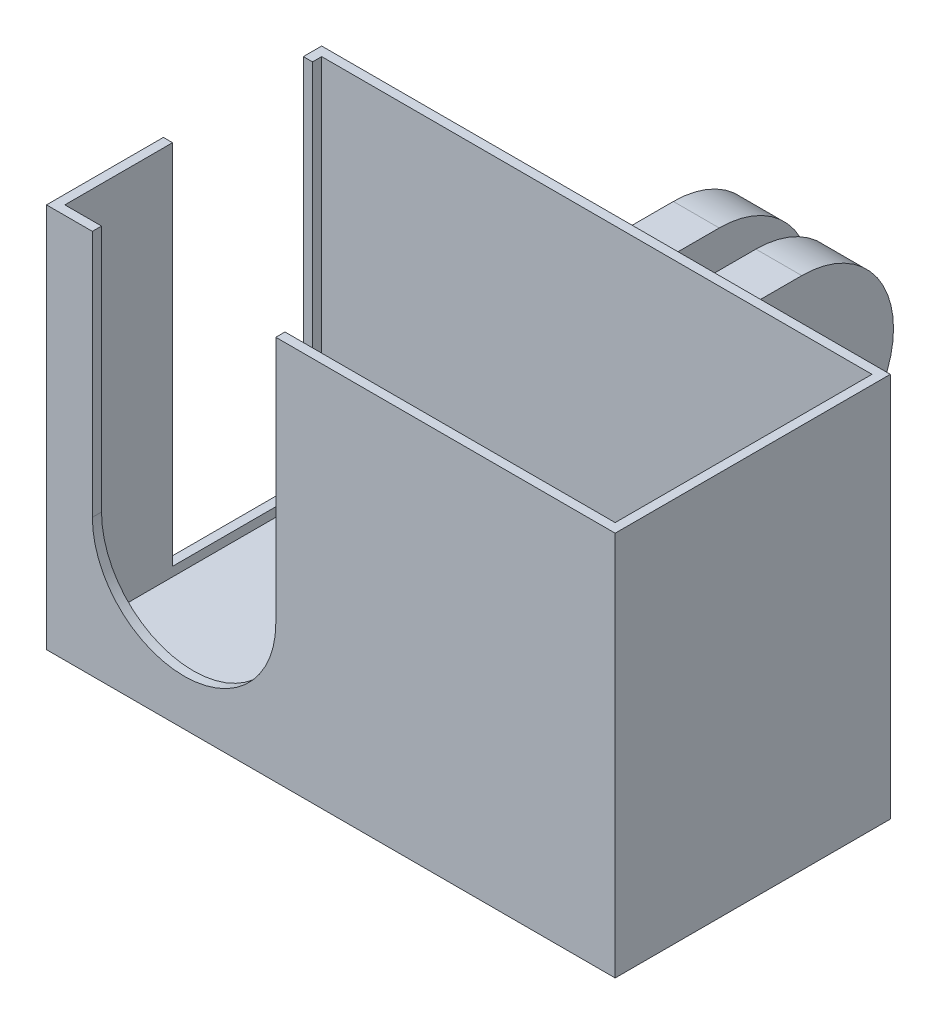
ISO-10303-21;
HEADER;
FILE_DESCRIPTION(('STEP AP214'),'2;1');
FILE_NAME('part.step','',(''),(''),'','','');
FILE_SCHEMA(('AUTOMOTIVE_DESIGN { 1 0 10303 214 1 1 1 1 }'));
ENDSEC;
DATA;
#1=APPLICATION_CONTEXT('core data for automotive mechanical design processes');
#2=APPLICATION_PROTOCOL_DEFINITION('international standard','automotive_design',2000,#1);
#3=PRODUCT_CONTEXT('',#1,'mechanical');
#4=PRODUCT('Part','Part','',(#3));
#5=PRODUCT_RELATED_PRODUCT_CATEGORY('part','',(#4));
#6=PRODUCT_DEFINITION_FORMATION('','',#4);
#7=PRODUCT_DEFINITION_CONTEXT('part definition',#1,'design');
#8=PRODUCT_DEFINITION('design','',#6,#7);
#9=PRODUCT_DEFINITION_SHAPE('','',#8);
#10=(LENGTH_UNIT() NAMED_UNIT(*) SI_UNIT(.MILLI.,.METRE.));
#11=(NAMED_UNIT(*) PLANE_ANGLE_UNIT() SI_UNIT($,.RADIAN.));
#12=(NAMED_UNIT(*) SI_UNIT($,.STERADIAN.) SOLID_ANGLE_UNIT());
#13=UNCERTAINTY_MEASURE_WITH_UNIT(LENGTH_MEASURE(1.E-05),#10,'distance_accuracy_value','');
#14=(GEOMETRIC_REPRESENTATION_CONTEXT(3) GLOBAL_UNCERTAINTY_ASSIGNED_CONTEXT((#13)) GLOBAL_UNIT_ASSIGNED_CONTEXT((#10,
#11,#12)) REPRESENTATION_CONTEXT('',''));
#15=CARTESIAN_POINT('',(0.,0.,0.));
#16=DIRECTION('',(0.,0.,1.));
#17=DIRECTION('',(1.,0.,0.));
#18=AXIS2_PLACEMENT_3D('',#15,#16,#17);
#19=CARTESIAN_POINT('',(-30.346218487395,18.5050420168067,30.));
#20=DIRECTION('',(0.,-1.,0.));
#21=DIRECTION('',(0.,0.,-1.));
#22=AXIS2_PLACEMENT_3D('',#19,#20,#21);
#23=PLANE('',#22);
#24=DIRECTION('',(0.,0.,-1.));
#25=VECTOR('',#24,1.);
#26=CARTESIAN_POINT('',(-30.346218487395,18.5050420168067,30.));
#27=LINE('',#26,#25);
#28=CARTESIAN_POINT('',(-30.346218487395,18.5050420168067,2.));
#29=VERTEX_POINT('',#28);
#30=CARTESIAN_POINT('',(-30.346218487395,18.5050420168067,0.));
#31=VERTEX_POINT('',#30);
#32=EDGE_CURVE('E363',#29,#31,#27,.T.);
#33=ORIENTED_EDGE('',*,*,#32,.F.);
#34=DIRECTION('',(-1.,0.,0.));
#35=VECTOR('',#34,1.);
#36=CARTESIAN_POINT('',(13.4641809395834,18.5050420168067,2.));
#37=LINE('',#36,#35);
#38=CARTESIAN_POINT('',(-29.346218487395,18.5050420168067,2.));
#39=VERTEX_POINT('',#38);
#40=EDGE_CURVE('E228',#39,#29,#37,.T.);
#41=ORIENTED_EDGE('',*,*,#40,.F.);
#42=DIRECTION('',(0.,0.,1.));
#43=VECTOR('',#42,1.);
#44=CARTESIAN_POINT('',(-29.346218487395,18.5050420168067,1.));
#45=LINE('',#44,#43);
#46=CARTESIAN_POINT('',(-29.346218487395,18.5050420168067,1.));
#47=VERTEX_POINT('',#46);
#48=EDGE_CURVE('E324',#47,#39,#45,.T.);
#49=ORIENTED_EDGE('',*,*,#48,.F.);
#50=DIRECTION('',(-1.,0.,0.));
#51=VECTOR('',#50,1.);
#52=CARTESIAN_POINT('',(-29.346218487395,18.5050420168067,1.));
#53=LINE('',#52,#51);
#54=CARTESIAN_POINT('',(30.653781512605,18.5050420168067,1.));
#55=VERTEX_POINT('',#54);
#56=EDGE_CURVE('E313',#55,#47,#53,.T.);
#57=ORIENTED_EDGE('',*,*,#56,.F.);
#58=DIRECTION('',(0.,0.,-1.));
#59=VECTOR('',#58,1.);
#60=CARTESIAN_POINT('',(30.653781512605,18.5050420168067,1.));
#61=LINE('',#60,#59);
#62=CARTESIAN_POINT('',(30.653781512605,18.5050420168067,29.));
#63=VERTEX_POINT('',#62);
#64=EDGE_CURVE('E317',#63,#55,#61,.T.);
#65=ORIENTED_EDGE('',*,*,#64,.F.);
#66=DIRECTION('',(1.,0.,0.));
#67=VECTOR('',#66,1.);
#68=CARTESIAN_POINT('',(-29.346218487395,18.5050420168067,29.));
#69=LINE('',#68,#67);
#70=CARTESIAN_POINT('',(-5.34621848739497,18.5050420168067,29.));
#71=VERTEX_POINT('',#70);
#72=EDGE_CURVE('E323',#71,#63,#69,.T.);
#73=ORIENTED_EDGE('',*,*,#72,.F.);
#74=DIRECTION('',(0.,0.,-1.));
#75=VECTOR('',#74,1.);
#76=CARTESIAN_POINT('',(-5.34621848739496,18.5050420168067,29.));
#77=LINE('',#76,#75);
#78=CARTESIAN_POINT('',(-5.34621848739496,18.5050420168067,30.));
#79=VERTEX_POINT('',#78);
#80=EDGE_CURVE('E297',#79,#71,#77,.T.);
#81=ORIENTED_EDGE('',*,*,#80,.F.);
#82=DIRECTION('',(-1.,0.,0.));
#83=VECTOR('',#82,1.);
#84=CARTESIAN_POINT('',(-30.346218487395,18.5050420168067,30.));
#85=LINE('',#84,#83);
#86=CARTESIAN_POINT('',(31.653781512605,18.5050420168067,30.));
#87=VERTEX_POINT('',#86);
#88=EDGE_CURVE('E360',#87,#79,#85,.T.);
#89=ORIENTED_EDGE('',*,*,#88,.F.);
#90=DIRECTION('',(0.,0.,-1.));
#91=VECTOR('',#90,1.);
#92=CARTESIAN_POINT('',(31.653781512605,18.5050420168067,30.));
#93=LINE('',#92,#91);
#94=CARTESIAN_POINT('',(31.653781512605,18.5050420168067,0.));
#95=VERTEX_POINT('',#94);
#96=EDGE_CURVE('E373',#87,#95,#93,.T.);
#97=ORIENTED_EDGE('',*,*,#96,.T.);
#98=DIRECTION('',(-1.,0.,0.));
#99=VECTOR('',#98,1.);
#100=CARTESIAN_POINT('',(-30.346218487395,18.5050420168067,0.));
#101=LINE('',#100,#99);
#102=EDGE_CURVE('E355',#95,#31,#101,.T.);
#103=ORIENTED_EDGE('',*,*,#102,.T.);
#104=EDGE_LOOP('',(#33,#41,#49,#57,#65,#73,#81,#89,#97,#103));
#105=FACE_BOUND('',#104,.T.);
#106=ADVANCED_FACE('F37',(#105),#23,.F.);
#107=CARTESIAN_POINT('',(0.,0.,0.));
#108=DIRECTION('',(0.,0.,1.));
#109=DIRECTION('',(1.,0.,0.));
#110=AXIS2_PLACEMENT_3D('',#107,#108,#109);
#111=PLANE('',#110);
#112=DIRECTION('',(0.,-1.,0.));
#113=VECTOR('',#112,1.);
#114=CARTESIAN_POINT('',(-30.346218487395,18.5050420168067,0.));
#115=LINE('',#114,#113);
#116=CARTESIAN_POINT('',(-30.346218487395,-23.4949579831933,0.));
#117=VERTEX_POINT('',#116);
#118=EDGE_CURVE('E350',#31,#117,#115,.T.);
#119=ORIENTED_EDGE('',*,*,#118,.F.);
#120=ORIENTED_EDGE('',*,*,#102,.F.);
#121=DIRECTION('',(0.,1.,0.));
#122=VECTOR('',#121,1.);
#123=CARTESIAN_POINT('',(31.653781512605,18.5050420168067,0.));
#124=LINE('',#123,#122);
#125=CARTESIAN_POINT('',(31.653781512605,-23.4949579831933,0.));
#126=VERTEX_POINT('',#125);
#127=EDGE_CURVE('E368',#126,#95,#124,.T.);
#128=ORIENTED_EDGE('',*,*,#127,.F.);
#129=DIRECTION('',(1.,0.,0.));
#130=VECTOR('',#129,1.);
#131=CARTESIAN_POINT('',(-30.346218487395,-23.4949579831933,0.));
#132=LINE('',#131,#130);
#133=EDGE_CURVE('E366',#117,#126,#132,.T.);
#134=ORIENTED_EDGE('',*,*,#133,.F.);
#135=EDGE_LOOP('',(#119,#120,#128,#134));
#136=FACE_BOUND('',#135,.T.);
#137=DIRECTION('',(-1.,0.,0.));
#138=VECTOR('',#137,1.);
#139=CARTESIAN_POINT('',(7.,7.99964293282017,0.));
#140=LINE('',#139,#138);
#141=CARTESIAN_POINT('',(7.,7.99964293282017,0.));
#142=VERTEX_POINT('',#141);
#143=CARTESIAN_POINT('',(2.,7.99964293282017,0.));
#144=VERTEX_POINT('',#143);
#145=EDGE_CURVE('E272',#142,#144,#140,.T.);
#146=ORIENTED_EDGE('',*,*,#145,.T.);
#147=DIRECTION('',(0.,-1.,0.));
#148=VECTOR('',#147,1.);
#149=CARTESIAN_POINT('',(2.,7.99964293282017,0.));
#150=LINE('',#149,#148);
#151=CARTESIAN_POINT('',(2.,-12.0003570671798,0.));
#152=VERTEX_POINT('',#151);
#153=EDGE_CURVE('E256',#144,#152,#150,.T.);
#154=ORIENTED_EDGE('',*,*,#153,.T.);
#155=DIRECTION('',(-1.,0.,0.));
#156=VECTOR('',#155,1.);
#157=CARTESIAN_POINT('',(7.,-12.0003570671798,0.));
#158=LINE('',#157,#156);
#159=CARTESIAN_POINT('',(7.,-12.0003570671798,0.));
#160=VERTEX_POINT('',#159);
#161=EDGE_CURVE('E289',#160,#152,#158,.T.);
#162=ORIENTED_EDGE('',*,*,#161,.F.);
#163=DIRECTION('',(0.,-1.,0.));
#164=VECTOR('',#163,1.);
#165=CARTESIAN_POINT('',(7.,7.99964293282017,0.));
#166=LINE('',#165,#164);
#167=EDGE_CURVE('E262',#142,#160,#166,.T.);
#168=ORIENTED_EDGE('',*,*,#167,.F.);
#169=EDGE_LOOP('',(#146,#154,#162,#168));
#170=FACE_BOUND('',#169,.T.);
#171=DIRECTION('',(0.,-1.,0.));
#172=VECTOR('',#171,1.);
#173=CARTESIAN_POINT('',(-7.,-12.0003570671798,0.));
#174=LINE('',#173,#172);
#175=CARTESIAN_POINT('',(-7.,7.99964293282017,0.));
#176=VERTEX_POINT('',#175);
#177=CARTESIAN_POINT('',(-7.,-12.0003570671798,0.));
#178=VERTEX_POINT('',#177);
#179=EDGE_CURVE('E243',#176,#178,#174,.T.);
#180=ORIENTED_EDGE('',*,*,#179,.T.);
#181=DIRECTION('',(1.,0.,0.));
#182=VECTOR('',#181,1.);
#183=CARTESIAN_POINT('',(-7.,-12.0003570671798,0.));
#184=LINE('',#183,#182);
#185=CARTESIAN_POINT('',(-2.,-12.0003570671798,0.));
#186=VERTEX_POINT('',#185);
#187=EDGE_CURVE('E253',#178,#186,#184,.T.);
#188=ORIENTED_EDGE('',*,*,#187,.T.);
#189=DIRECTION('',(0.,-1.,0.));
#190=VECTOR('',#189,1.);
#191=CARTESIAN_POINT('',(-2.,-12.0003570671798,0.));
#192=LINE('',#191,#190);
#193=CARTESIAN_POINT('',(-2.,7.99964293282017,0.));
#194=VERTEX_POINT('',#193);
#195=EDGE_CURVE('E238',#194,#186,#192,.T.);
#196=ORIENTED_EDGE('',*,*,#195,.F.);
#197=DIRECTION('',(1.,0.,0.));
#198=VECTOR('',#197,1.);
#199=CARTESIAN_POINT('',(-7.,7.99964293282017,0.));
#200=LINE('',#199,#198);
#201=EDGE_CURVE('E257',#176,#194,#200,.T.);
#202=ORIENTED_EDGE('',*,*,#201,.F.);
#203=EDGE_LOOP('',(#180,#188,#196,#202));
#204=FACE_BOUND('',#203,.T.);
#205=ADVANCED_FACE('F387',(#136,#170,#204),#111,.F.);
#206=CARTESIAN_POINT('',(-15.346218487395,-8.49495798319328,24.));
#207=DIRECTION('',(0.,0.,1.));
#208=DIRECTION('',(1.,0.,0.));
#209=AXIS2_PLACEMENT_3D('',#206,#207,#208);
#210=CYLINDRICAL_SURFACE('',#209,10.);
#211=DIRECTION('',(0.,0.,1.));
#212=VECTOR('',#211,1.);
#213=CARTESIAN_POINT('',(-25.346218487395,-8.49495798319327,29.));
#214=LINE('',#213,#212);
#215=CARTESIAN_POINT('',(-25.346218487395,-8.49495798319327,29.));
#216=VERTEX_POINT('',#215);
#217=CARTESIAN_POINT('',(-25.346218487395,-8.49495798319327,30.));
#218=VERTEX_POINT('',#217);
#219=EDGE_CURVE('E293',#216,#218,#214,.T.);
#220=ORIENTED_EDGE('',*,*,#219,.T.);
#221=CARTESIAN_POINT('',(-15.346218487395,-8.49495798319328,30.));
#222=DIRECTION('',(0.,0.,1.));
#223=DIRECTION('',(1.,0.,0.));
#224=AXIS2_PLACEMENT_3D('',#221,#222,#223);
#225=CIRCLE('',#224,10.);
#226=CARTESIAN_POINT('',(-5.34621848739496,-8.49495798319327,30.));
#227=VERTEX_POINT('',#226);
#228=EDGE_CURVE('E346',#218,#227,#225,.T.);
#229=ORIENTED_EDGE('',*,*,#228,.T.);
#230=DIRECTION('',(0.,0.,-1.));
#231=VECTOR('',#230,1.);
#232=CARTESIAN_POINT('',(-5.34621848739496,-8.49495798319327,29.));
#233=LINE('',#232,#231);
#234=CARTESIAN_POINT('',(-5.34621848739496,-8.49495798319327,29.));
#235=VERTEX_POINT('',#234);
#236=EDGE_CURVE('E296',#227,#235,#233,.T.);
#237=ORIENTED_EDGE('',*,*,#236,.T.);
#238=CARTESIAN_POINT('',(-15.346218487395,-8.49495798319328,29.));
#239=DIRECTION('',(0.,0.,1.));
#240=DIRECTION('',(1.,0.,0.));
#241=AXIS2_PLACEMENT_3D('',#238,#239,#240);
#242=CIRCLE('',#241,10.);
#243=EDGE_CURVE('E41',#235,#216,#242,.F.);
#244=ORIENTED_EDGE('',*,*,#243,.T.);
#245=EDGE_LOOP('',(#220,#229,#237,#244));
#246=FACE_BOUND('',#245,.T.);
#247=ADVANCED_FACE('F440',(#246),#210,.F.);
#248=CARTESIAN_POINT('',(-30.346218487395,18.5050420168067,30.));
#249=DIRECTION('',(1.,0.,0.));
#250=DIRECTION('',(0.,0.,-1.));
#251=AXIS2_PLACEMENT_3D('',#248,#249,#250);
#252=PLANE('',#251);
#253=DIRECTION('',(0.,0.,1.));
#254=VECTOR('',#253,1.);
#255=CARTESIAN_POINT('',(-30.346218487395,-21.4949579831933,2.));
#256=LINE('',#255,#254);
#257=CARTESIAN_POINT('',(-30.346218487395,-21.4949579831933,2.));
#258=VERTEX_POINT('',#257);
#259=CARTESIAN_POINT('',(-30.346218487395,-21.4949579831933,17.2555006177255));
#260=VERTEX_POINT('',#259);
#261=EDGE_CURVE('E210',#258,#260,#256,.T.);
#262=ORIENTED_EDGE('',*,*,#261,.F.);
#263=DIRECTION('',(0.,-1.,0.));
#264=VECTOR('',#263,1.);
#265=CARTESIAN_POINT('',(-30.346218487395,-21.4949579831933,2.));
#266=LINE('',#265,#264);
#267=EDGE_CURVE('E207',#29,#258,#266,.T.);
#268=ORIENTED_EDGE('',*,*,#267,.F.);
#269=ORIENTED_EDGE('',*,*,#32,.T.);
#270=ORIENTED_EDGE('',*,*,#118,.T.);
#271=DIRECTION('',(0.,0.,-1.));
#272=VECTOR('',#271,1.);
#273=CARTESIAN_POINT('',(-30.346218487395,-23.4949579831933,30.));
#274=LINE('',#273,#272);
#275=CARTESIAN_POINT('',(-30.346218487395,-23.4949579831933,30.));
#276=VERTEX_POINT('',#275);
#277=EDGE_CURVE('E11',#276,#117,#274,.T.);
#278=ORIENTED_EDGE('',*,*,#277,.F.);
#279=DIRECTION('',(0.,-1.,0.));
#280=VECTOR('',#279,1.);
#281=CARTESIAN_POINT('',(-30.346218487395,18.5050420168067,30.));
#282=LINE('',#281,#280);
#283=CARTESIAN_POINT('',(-30.346218487395,18.5050420168067,30.));
#284=VERTEX_POINT('',#283);
#285=EDGE_CURVE('E351',#284,#276,#282,.T.);
#286=ORIENTED_EDGE('',*,*,#285,.F.);
#287=CARTESIAN_POINT('',(-30.346218487395,18.5050420168067,17.2555006177255));
#288=VERTEX_POINT('',#287);
#289=EDGE_CURVE('E221',#284,#288,#27,.T.);
#290=ORIENTED_EDGE('',*,*,#289,.T.);
#291=DIRECTION('',(0.,1.,0.));
#292=VECTOR('',#291,1.);
#293=CARTESIAN_POINT('',(-30.346218487395,-21.4949579831933,17.2555006177255));
#294=LINE('',#293,#292);
#295=EDGE_CURVE('E203',#260,#288,#294,.T.);
#296=ORIENTED_EDGE('',*,*,#295,.F.);
#297=EDGE_LOOP('',(#262,#268,#269,#270,#278,#286,#290,#296));
#298=FACE_BOUND('',#297,.T.);
#299=ADVANCED_FACE('F39',(#298),#252,.F.);
#300=CARTESIAN_POINT('',(-30.346218487395,-23.4949579831933,30.));
#301=DIRECTION('',(0.,1.,0.));
#302=DIRECTION('',(0.,0.,1.));
#303=AXIS2_PLACEMENT_3D('',#300,#301,#302);
#304=PLANE('',#303);
#305=ORIENTED_EDGE('',*,*,#133,.T.);
#306=DIRECTION('',(0.,0.,-1.));
#307=VECTOR('',#306,1.);
#308=CARTESIAN_POINT('',(31.653781512605,-23.4949579831933,30.));
#309=LINE('',#308,#307);
#310=CARTESIAN_POINT('',(31.653781512605,-23.4949579831933,30.));
#311=VERTEX_POINT('',#310);
#312=EDGE_CURVE('E46',#311,#126,#309,.T.);
#313=ORIENTED_EDGE('',*,*,#312,.F.);
#314=DIRECTION('',(1.,0.,0.));
#315=VECTOR('',#314,1.);
#316=CARTESIAN_POINT('',(-30.346218487395,-23.4949579831933,30.));
#317=LINE('',#316,#315);
#318=EDGE_CURVE('E354',#276,#311,#317,.T.);
#319=ORIENTED_EDGE('',*,*,#318,.F.);
#320=ORIENTED_EDGE('',*,*,#277,.T.);
#321=EDGE_LOOP('',(#305,#313,#319,#320));
#322=FACE_BOUND('',#321,.T.);
#323=ADVANCED_FACE('F400',(#322),#304,.F.);
#324=CARTESIAN_POINT('',(31.653781512605,18.5050420168067,30.));
#325=DIRECTION('',(-1.,0.,0.));
#326=DIRECTION('',(0.,-1.,0.));
#327=AXIS2_PLACEMENT_3D('',#324,#325,#326);
#328=PLANE('',#327);
#329=ORIENTED_EDGE('',*,*,#127,.T.);
#330=ORIENTED_EDGE('',*,*,#96,.F.);
#331=DIRECTION('',(0.,1.,0.));
#332=VECTOR('',#331,1.);
#333=CARTESIAN_POINT('',(31.653781512605,18.5050420168067,30.));
#334=LINE('',#333,#332);
#335=EDGE_CURVE('E357',#311,#87,#334,.T.);
#336=ORIENTED_EDGE('',*,*,#335,.F.);
#337=ORIENTED_EDGE('',*,*,#312,.T.);
#338=EDGE_LOOP('',(#329,#330,#336,#337));
#339=FACE_BOUND('',#338,.T.);
#340=ADVANCED_FACE('F381',(#339),#328,.F.);
#341=CARTESIAN_POINT('',(-29.346218487395,18.5050420168067,17.2555006177255));
#342=VERTEX_POINT('',#341);
#343=CARTESIAN_POINT('',(-29.346218487395,18.5050420168067,29.));
#344=VERTEX_POINT('',#343);
#345=EDGE_CURVE('E305',#342,#344,#45,.T.);
#346=ORIENTED_EDGE('',*,*,#345,.F.);
#347=DIRECTION('',(-1.,0.,0.));
#348=VECTOR('',#347,1.);
#349=CARTESIAN_POINT('',(13.4641809395834,18.5050420168067,17.2555006177255));
#350=LINE('',#349,#348);
#351=EDGE_CURVE('E53',#342,#288,#350,.T.);
#352=ORIENTED_EDGE('',*,*,#351,.T.);
#353=ORIENTED_EDGE('',*,*,#289,.F.);
#354=CARTESIAN_POINT('',(-25.346218487395,18.5050420168067,30.));
#355=VERTEX_POINT('',#354);
#356=EDGE_CURVE('E359',#355,#284,#85,.T.);
#357=ORIENTED_EDGE('',*,*,#356,.F.);
#358=DIRECTION('',(0.,0.,1.));
#359=VECTOR('',#358,1.);
#360=CARTESIAN_POINT('',(-25.346218487395,18.5050420168067,29.));
#361=LINE('',#360,#359);
#362=CARTESIAN_POINT('',(-25.346218487395,18.5050420168067,29.));
#363=VERTEX_POINT('',#362);
#364=EDGE_CURVE('E292',#363,#355,#361,.T.);
#365=ORIENTED_EDGE('',*,*,#364,.F.);
#366=EDGE_CURVE('E320',#344,#363,#69,.T.);
#367=ORIENTED_EDGE('',*,*,#366,.F.);
#368=EDGE_LOOP('',(#346,#352,#353,#357,#365,#367));
#369=FACE_BOUND('',#368,.T.);
#370=ADVANCED_FACE('F436',(#369),#23,.F.);
#371=CARTESIAN_POINT('',(0.,0.,30.));
#372=DIRECTION('',(0.,0.,1.));
#373=DIRECTION('',(1.,0.,0.));
#374=AXIS2_PLACEMENT_3D('',#371,#372,#373);
#375=PLANE('',#374);
#376=DIRECTION('',(0.,1.,0.));
#377=VECTOR('',#376,1.);
#378=CARTESIAN_POINT('',(-25.346218487395,-8.49495798319327,30.));
#379=LINE('',#378,#377);
#380=EDGE_CURVE('E300',#218,#355,#379,.T.);
#381=ORIENTED_EDGE('',*,*,#380,.T.);
#382=ORIENTED_EDGE('',*,*,#356,.T.);
#383=ORIENTED_EDGE('',*,*,#285,.T.);
#384=ORIENTED_EDGE('',*,*,#318,.T.);
#385=ORIENTED_EDGE('',*,*,#335,.T.);
#386=ORIENTED_EDGE('',*,*,#88,.T.);
#387=DIRECTION('',(0.,1.,0.));
#388=VECTOR('',#387,1.);
#389=CARTESIAN_POINT('',(-5.34621848739496,-8.49495798319327,30.));
#390=LINE('',#389,#388);
#391=EDGE_CURVE('E309',#227,#79,#390,.T.);
#392=ORIENTED_EDGE('',*,*,#391,.F.);
#393=ORIENTED_EDGE('',*,*,#228,.F.);
#394=EDGE_LOOP('',(#381,#382,#383,#384,#385,#386,#392,#393));
#395=FACE_BOUND('',#394,.T.);
#396=ADVANCED_FACE('F397',(#395),#375,.T.);
#397=CARTESIAN_POINT('',(-29.346218487395,-88.7067394121807,29.));
#398=DIRECTION('',(0.,0.,1.));
#399=DIRECTION('',(1.,0.,0.));
#400=AXIS2_PLACEMENT_3D('',#397,#398,#399);
#401=PLANE('',#400);
#402=ORIENTED_EDGE('',*,*,#366,.T.);
#403=DIRECTION('',(0.,1.,0.));
#404=VECTOR('',#403,1.);
#405=CARTESIAN_POINT('',(-25.346218487395,-8.49495798319327,29.));
#406=LINE('',#405,#404);
#407=EDGE_CURVE('E303',#216,#363,#406,.T.);
#408=ORIENTED_EDGE('',*,*,#407,.F.);
#409=ORIENTED_EDGE('',*,*,#243,.F.);
#410=DIRECTION('',(0.,1.,0.));
#411=VECTOR('',#410,1.);
#412=CARTESIAN_POINT('',(-5.34621848739496,-8.49495798319327,29.));
#413=LINE('',#412,#411);
#414=EDGE_CURVE('E306',#235,#71,#413,.T.);
#415=ORIENTED_EDGE('',*,*,#414,.T.);
#416=ORIENTED_EDGE('',*,*,#72,.T.);
#417=DIRECTION('',(0.,1.,0.));
#418=VECTOR('',#417,1.);
#419=CARTESIAN_POINT('',(30.653781512605,-88.7067394121807,29.));
#420=LINE('',#419,#418);
#421=CARTESIAN_POINT('',(30.653781512605,-22.4949579831933,29.));
#422=VERTEX_POINT('',#421);
#423=EDGE_CURVE('E329',#422,#63,#420,.T.);
#424=ORIENTED_EDGE('',*,*,#423,.F.);
#425=DIRECTION('',(1.,0.,0.));
#426=VECTOR('',#425,1.);
#427=CARTESIAN_POINT('',(-29.346218487395,-22.4949579831933,29.));
#428=LINE('',#427,#426);
#429=CARTESIAN_POINT('',(-29.346218487395,-22.4949579831933,29.));
#430=VERTEX_POINT('',#429);
#431=EDGE_CURVE('E316',#430,#422,#428,.T.);
#432=ORIENTED_EDGE('',*,*,#431,.F.);
#433=DIRECTION('',(0.,1.,0.));
#434=VECTOR('',#433,1.);
#435=CARTESIAN_POINT('',(-29.346218487395,-88.7067394121807,29.));
#436=LINE('',#435,#434);
#437=EDGE_CURVE('E332',#430,#344,#436,.T.);
#438=ORIENTED_EDGE('',*,*,#437,.T.);
#439=EDGE_LOOP('',(#402,#408,#409,#415,#416,#424,#432,#438));
#440=FACE_BOUND('',#439,.T.);
#441=ADVANCED_FACE('F419',(#440),#401,.F.);
#442=CARTESIAN_POINT('',(-29.346218487395,17.5050420168067,0.999999999999997));
#443=DIRECTION('',(-1.,0.,0.));
#444=DIRECTION('',(0.,-1.,0.));
#445=AXIS2_PLACEMENT_3D('',#442,#443,#444);
#446=PLANE('',#445);
#447=ORIENTED_EDGE('',*,*,#48,.T.);
#448=DIRECTION('',(0.,1.,0.));
#449=VECTOR('',#448,1.);
#450=CARTESIAN_POINT('',(-29.346218487395,-21.4949579831933,2.));
#451=LINE('',#450,#449);
#452=CARTESIAN_POINT('',(-29.346218487395,-21.4949579831933,2.));
#453=VERTEX_POINT('',#452);
#454=EDGE_CURVE('E227',#453,#39,#451,.T.);
#455=ORIENTED_EDGE('',*,*,#454,.F.);
#456=DIRECTION('',(0.,0.,-1.));
#457=VECTOR('',#456,1.);
#458=CARTESIAN_POINT('',(-29.346218487395,-21.4949579831933,2.));
#459=LINE('',#458,#457);
#460=CARTESIAN_POINT('',(-29.346218487395,-21.4949579831933,17.2555006177255));
#461=VERTEX_POINT('',#460);
#462=EDGE_CURVE('E233',#461,#453,#459,.T.);
#463=ORIENTED_EDGE('',*,*,#462,.F.);
#464=DIRECTION('',(0.,-1.,0.));
#465=VECTOR('',#464,1.);
#466=CARTESIAN_POINT('',(-29.346218487395,-21.4949579831933,17.2555006177255));
#467=LINE('',#466,#465);
#468=EDGE_CURVE('E204',#342,#461,#467,.T.);
#469=ORIENTED_EDGE('',*,*,#468,.F.);
#470=ORIENTED_EDGE('',*,*,#345,.T.);
#471=ORIENTED_EDGE('',*,*,#437,.F.);
#472=DIRECTION('',(0.,0.,1.));
#473=VECTOR('',#472,1.);
#474=CARTESIAN_POINT('',(-29.346218487395,-22.4949579831933,0.999999999999997));
#475=LINE('',#474,#473);
#476=CARTESIAN_POINT('',(-29.346218487395,-22.4949579831933,0.999999999999997));
#477=VERTEX_POINT('',#476);
#478=EDGE_CURVE('E343',#477,#430,#475,.T.);
#479=ORIENTED_EDGE('',*,*,#478,.F.);
#480=DIRECTION('',(0.,-1.,0.));
#481=VECTOR('',#480,1.);
#482=CARTESIAN_POINT('',(-29.346218487395,17.5050420168067,0.999999999999997));
#483=LINE('',#482,#481);
#484=EDGE_CURVE('E335',#47,#477,#483,.T.);
#485=ORIENTED_EDGE('',*,*,#484,.F.);
#486=EDGE_LOOP('',(#447,#455,#463,#469,#470,#471,#479,#485));
#487=FACE_BOUND('',#486,.T.);
#488=ADVANCED_FACE('F407',(#487),#446,.F.);
#489=CARTESIAN_POINT('',(0.,0.,0.999999999999997));
#490=DIRECTION('',(0.,0.,1.));
#491=DIRECTION('',(1.,0.,0.));
#492=AXIS2_PLACEMENT_3D('',#489,#490,#491);
#493=PLANE('',#492);
#494=ORIENTED_EDGE('',*,*,#484,.T.);
#495=DIRECTION('',(1.,0.,0.));
#496=VECTOR('',#495,1.);
#497=CARTESIAN_POINT('',(-29.346218487395,-22.4949579831933,0.999999999999997));
#498=LINE('',#497,#496);
#499=CARTESIAN_POINT('',(30.6537815126051,-22.4949579831933,0.999999999999997));
#500=VERTEX_POINT('',#499);
#501=EDGE_CURVE('E338',#477,#500,#498,.T.);
#502=ORIENTED_EDGE('',*,*,#501,.T.);
#503=DIRECTION('',(0.,1.,0.));
#504=VECTOR('',#503,1.);
#505=CARTESIAN_POINT('',(30.653781512605,17.5050420168067,0.999999999999997));
#506=LINE('',#505,#504);
#507=EDGE_CURVE('E341',#500,#55,#506,.T.);
#508=ORIENTED_EDGE('',*,*,#507,.T.);
#509=ORIENTED_EDGE('',*,*,#56,.T.);
#510=EDGE_LOOP('',(#494,#502,#508,#509));
#511=FACE_BOUND('',#510,.T.);
#512=ADVANCED_FACE('F411',(#511),#493,.T.);
#513=CARTESIAN_POINT('',(30.653781512605,17.5050420168067,0.999999999999997));
#514=DIRECTION('',(1.,0.,0.));
#515=DIRECTION('',(0.,1.,0.));
#516=AXIS2_PLACEMENT_3D('',#513,#514,#515);
#517=PLANE('',#516);
#518=DIRECTION('',(0.,0.,1.));
#519=VECTOR('',#518,1.);
#520=CARTESIAN_POINT('',(30.6537815126051,-22.4949579831933,0.999999999999997));
#521=LINE('',#520,#519);
#522=EDGE_CURVE('E344',#500,#422,#521,.T.);
#523=ORIENTED_EDGE('',*,*,#522,.T.);
#524=ORIENTED_EDGE('',*,*,#423,.T.);
#525=ORIENTED_EDGE('',*,*,#64,.T.);
#526=ORIENTED_EDGE('',*,*,#507,.F.);
#527=EDGE_LOOP('',(#523,#524,#525,#526));
#528=FACE_BOUND('',#527,.T.);
#529=ADVANCED_FACE('F415',(#528),#517,.F.);
#530=CARTESIAN_POINT('',(-29.346218487395,-22.4949579831933,0.999999999999997));
#531=DIRECTION('',(0.,-1.,0.));
#532=DIRECTION('',(0.,0.,-1.));
#533=AXIS2_PLACEMENT_3D('',#530,#531,#532);
#534=PLANE('',#533);
#535=ORIENTED_EDGE('',*,*,#478,.T.);
#536=ORIENTED_EDGE('',*,*,#431,.T.);
#537=ORIENTED_EDGE('',*,*,#522,.F.);
#538=ORIENTED_EDGE('',*,*,#501,.F.);
#539=EDGE_LOOP('',(#535,#536,#537,#538));
#540=FACE_BOUND('',#539,.T.);
#541=ADVANCED_FACE('F421',(#540),#534,.F.);
#542=CARTESIAN_POINT('',(-5.34621848739496,-8.49495798319327,29.));
#543=DIRECTION('',(1.,0.,0.));
#544=DIRECTION('',(0.,0.,-1.));
#545=AXIS2_PLACEMENT_3D('',#542,#543,#544);
#546=PLANE('',#545);
#547=ORIENTED_EDGE('',*,*,#80,.T.);
#548=ORIENTED_EDGE('',*,*,#414,.F.);
#549=ORIENTED_EDGE('',*,*,#236,.F.);
#550=ORIENTED_EDGE('',*,*,#391,.T.);
#551=EDGE_LOOP('',(#547,#548,#549,#550));
#552=FACE_BOUND('',#551,.T.);
#553=ADVANCED_FACE('F423',(#552),#546,.F.);
#554=CARTESIAN_POINT('',(-25.346218487395,-8.49495798319327,29.));
#555=DIRECTION('',(-1.,0.,0.));
#556=DIRECTION('',(0.,0.,1.));
#557=AXIS2_PLACEMENT_3D('',#554,#555,#556);
#558=PLANE('',#557);
#559=ORIENTED_EDGE('',*,*,#364,.T.);
#560=ORIENTED_EDGE('',*,*,#380,.F.);
#561=ORIENTED_EDGE('',*,*,#219,.F.);
#562=ORIENTED_EDGE('',*,*,#407,.T.);
#563=EDGE_LOOP('',(#559,#560,#561,#562));
#564=FACE_BOUND('',#563,.T.);
#565=ADVANCED_FACE('F429',(#564),#558,.F.);
#566=CARTESIAN_POINT('',(7.,-12.0003570671798,0.));
#567=DIRECTION('',(0.,1.,0.));
#568=DIRECTION('',(0.,0.,1.));
#569=AXIS2_PLACEMENT_3D('',#566,#567,#568);
#570=PLANE('',#569);
#571=DIRECTION('',(0.,0.,-1.));
#572=VECTOR('',#571,1.);
#573=CARTESIAN_POINT('',(2.,-12.0003570671798,0.));
#574=LINE('',#573,#572);
#575=CARTESIAN_POINT('',(2.,-12.0003570671798,-15.));
#576=VERTEX_POINT('',#575);
#577=EDGE_CURVE('E275',#152,#576,#574,.T.);
#578=ORIENTED_EDGE('',*,*,#577,.T.);
#579=DIRECTION('',(-1.,0.,0.));
#580=VECTOR('',#579,1.);
#581=CARTESIAN_POINT('',(7.,-12.0003570671798,-15.));
#582=LINE('',#581,#580);
#583=CARTESIAN_POINT('',(7.,-12.0003570671798,-15.));
#584=VERTEX_POINT('',#583);
#585=EDGE_CURVE('E286',#584,#576,#582,.T.);
#586=ORIENTED_EDGE('',*,*,#585,.F.);
#587=DIRECTION('',(0.,0.,-1.));
#588=VECTOR('',#587,1.);
#589=CARTESIAN_POINT('',(7.,-12.0003570671798,0.));
#590=LINE('',#589,#588);
#591=EDGE_CURVE('E265',#160,#584,#590,.T.);
#592=ORIENTED_EDGE('',*,*,#591,.F.);
#593=ORIENTED_EDGE('',*,*,#161,.T.);
#594=EDGE_LOOP('',(#578,#586,#592,#593));
#595=FACE_BOUND('',#594,.T.);
#596=ADVANCED_FACE('F460',(#595),#570,.F.);
#597=CARTESIAN_POINT('',(7.,-2.00035706717983,-15.));
#598=DIRECTION('',(-1.,0.,0.));
#599=DIRECTION('',(0.,0.,1.));
#600=AXIS2_PLACEMENT_3D('',#597,#598,#599);
#601=CYLINDRICAL_SURFACE('',#600,10.);
#602=CARTESIAN_POINT('',(2.,-2.00035706717983,-15.));
#603=DIRECTION('',(1.,0.,0.));
#604=DIRECTION('',(0.,0.,1.));
#605=AXIS2_PLACEMENT_3D('',#602,#603,#604);
#606=CIRCLE('',#605,10.);
#607=CARTESIAN_POINT('',(2.,7.99964293282017,-15.));
#608=VERTEX_POINT('',#607);
#609=EDGE_CURVE('E277',#576,#608,#606,.T.);
#610=ORIENTED_EDGE('',*,*,#609,.T.);
#611=DIRECTION('',(-1.,0.,0.));
#612=VECTOR('',#611,1.);
#613=CARTESIAN_POINT('',(7.,7.99964293282017,-15.));
#614=LINE('',#613,#612);
#615=CARTESIAN_POINT('',(7.,7.99964293282017,-15.));
#616=VERTEX_POINT('',#615);
#617=EDGE_CURVE('E283',#616,#608,#614,.T.);
#618=ORIENTED_EDGE('',*,*,#617,.F.);
#619=CARTESIAN_POINT('',(7.,-2.00035706717983,-15.));
#620=DIRECTION('',(1.,0.,0.));
#621=DIRECTION('',(0.,0.,1.));
#622=AXIS2_PLACEMENT_3D('',#619,#620,#621);
#623=CIRCLE('',#622,10.);
#624=EDGE_CURVE('E268',#584,#616,#623,.T.);
#625=ORIENTED_EDGE('',*,*,#624,.F.);
#626=ORIENTED_EDGE('',*,*,#585,.T.);
#627=EDGE_LOOP('',(#610,#618,#625,#626));
#628=FACE_BOUND('',#627,.T.);
#629=ADVANCED_FACE('F465',(#628),#601,.T.);
#630=CARTESIAN_POINT('',(7.,7.99964293282017,0.));
#631=DIRECTION('',(0.,-1.,0.));
#632=DIRECTION('',(0.,0.,-1.));
#633=AXIS2_PLACEMENT_3D('',#630,#631,#632);
#634=PLANE('',#633);
#635=DIRECTION('',(0.,0.,1.));
#636=VECTOR('',#635,1.);
#637=CARTESIAN_POINT('',(2.,7.99964293282017,0.));
#638=LINE('',#637,#636);
#639=EDGE_CURVE('E266',#608,#144,#638,.T.);
#640=ORIENTED_EDGE('',*,*,#639,.T.);
#641=ORIENTED_EDGE('',*,*,#145,.F.);
#642=DIRECTION('',(0.,0.,1.));
#643=VECTOR('',#642,1.);
#644=CARTESIAN_POINT('',(7.,7.99964293282017,0.));
#645=LINE('',#644,#643);
#646=EDGE_CURVE('E270',#616,#142,#645,.T.);
#647=ORIENTED_EDGE('',*,*,#646,.F.);
#648=ORIENTED_EDGE('',*,*,#617,.T.);
#649=EDGE_LOOP('',(#640,#641,#647,#648));
#650=FACE_BOUND('',#649,.T.);
#651=ADVANCED_FACE('F552',(#650),#634,.F.);
#652=CARTESIAN_POINT('',(7.,-2.00035706717983,-15.));
#653=DIRECTION('',(-1.,0.,0.));
#654=DIRECTION('',(0.,0.,1.));
#655=AXIS2_PLACEMENT_3D('',#652,#653,#654);
#656=PLANE('',#655);
#657=ORIENTED_EDGE('',*,*,#167,.T.);
#658=ORIENTED_EDGE('',*,*,#591,.T.);
#659=ORIENTED_EDGE('',*,*,#624,.T.);
#660=ORIENTED_EDGE('',*,*,#646,.T.);
#661=EDGE_LOOP('',(#657,#658,#659,#660));
#662=FACE_BOUND('',#661,.T.);
#663=ADVANCED_FACE('F562',(#662),#656,.F.);
#664=CARTESIAN_POINT('',(2.,-2.00035706717983,-15.));
#665=DIRECTION('',(-1.,0.,0.));
#666=DIRECTION('',(0.,0.,1.));
#667=AXIS2_PLACEMENT_3D('',#664,#665,#666);
#668=PLANE('',#667);
#669=ORIENTED_EDGE('',*,*,#153,.F.);
#670=ORIENTED_EDGE('',*,*,#639,.F.);
#671=ORIENTED_EDGE('',*,*,#609,.F.);
#672=ORIENTED_EDGE('',*,*,#577,.F.);
#673=EDGE_LOOP('',(#669,#670,#671,#672));
#674=FACE_BOUND('',#673,.T.);
#675=ADVANCED_FACE('F572',(#674),#668,.T.);
#676=CARTESIAN_POINT('',(-7.,-12.0003570671798,0.));
#677=DIRECTION('',(0.,-1.,0.));
#678=DIRECTION('',(0.,0.,-1.));
#679=AXIS2_PLACEMENT_3D('',#676,#677,#678);
#680=PLANE('',#679);
#681=DIRECTION('',(0.,0.,-1.));
#682=VECTOR('',#681,1.);
#683=CARTESIAN_POINT('',(-2.,-12.0003570671798,0.));
#684=LINE('',#683,#682);
#685=CARTESIAN_POINT('',(-2.,-12.0003570671798,-15.));
#686=VERTEX_POINT('',#685);
#687=EDGE_CURVE('E232',#186,#686,#684,.T.);
#688=ORIENTED_EDGE('',*,*,#687,.F.);
#689=ORIENTED_EDGE('',*,*,#187,.F.);
#690=DIRECTION('',(0.,0.,-1.));
#691=VECTOR('',#690,1.);
#692=CARTESIAN_POINT('',(-7.,-12.0003570671798,0.));
#693=LINE('',#692,#691);
#694=CARTESIAN_POINT('',(-7.,-12.0003570671798,-15.));
#695=VERTEX_POINT('',#694);
#696=EDGE_CURVE('E234',#178,#695,#693,.T.);
#697=ORIENTED_EDGE('',*,*,#696,.T.);
#698=DIRECTION('',(1.,0.,0.));
#699=VECTOR('',#698,1.);
#700=CARTESIAN_POINT('',(-7.,-12.0003570671798,-15.));
#701=LINE('',#700,#699);
#702=EDGE_CURVE('E246',#695,#686,#701,.T.);
#703=ORIENTED_EDGE('',*,*,#702,.T.);
#704=EDGE_LOOP('',(#688,#689,#697,#703));
#705=FACE_BOUND('',#704,.T.);
#706=ADVANCED_FACE('F582',(#705),#680,.T.);
#707=CARTESIAN_POINT('',(-7.,7.99964293282017,0.));
#708=DIRECTION('',(0.,1.,0.));
#709=DIRECTION('',(0.,0.,1.));
#710=AXIS2_PLACEMENT_3D('',#707,#708,#709);
#711=PLANE('',#710);
#712=DIRECTION('',(0.,0.,1.));
#713=VECTOR('',#712,1.);
#714=CARTESIAN_POINT('',(-2.,7.99964293282017,0.));
#715=LINE('',#714,#713);
#716=CARTESIAN_POINT('',(-2.,7.99964293282017,-15.));
#717=VERTEX_POINT('',#716);
#718=EDGE_CURVE('E61',#717,#194,#715,.T.);
#719=ORIENTED_EDGE('',*,*,#718,.F.);
#720=DIRECTION('',(1.,0.,0.));
#721=VECTOR('',#720,1.);
#722=CARTESIAN_POINT('',(-7.,7.99964293282017,-15.));
#723=LINE('',#722,#721);
#724=CARTESIAN_POINT('',(-7.,7.99964293282017,-15.));
#725=VERTEX_POINT('',#724);
#726=EDGE_CURVE('E259',#725,#717,#723,.T.);
#727=ORIENTED_EDGE('',*,*,#726,.F.);
#728=DIRECTION('',(0.,0.,1.));
#729=VECTOR('',#728,1.);
#730=CARTESIAN_POINT('',(-7.,7.99964293282017,0.));
#731=LINE('',#730,#729);
#732=EDGE_CURVE('E241',#725,#176,#731,.T.);
#733=ORIENTED_EDGE('',*,*,#732,.T.);
#734=ORIENTED_EDGE('',*,*,#201,.T.);
#735=EDGE_LOOP('',(#719,#727,#733,#734));
#736=FACE_BOUND('',#735,.T.);
#737=ADVANCED_FACE('F598',(#736),#711,.T.);
#738=CARTESIAN_POINT('',(-7.,-2.00035706717983,-15.));
#739=DIRECTION('',(1.,0.,0.));
#740=DIRECTION('',(0.,0.,-1.));
#741=AXIS2_PLACEMENT_3D('',#738,#739,#740);
#742=CYLINDRICAL_SURFACE('',#741,10.);
#743=CARTESIAN_POINT('',(-2.,-2.00035706717983,-15.));
#744=DIRECTION('',(1.,0.,0.));
#745=DIRECTION('',(0.,0.,-1.));
#746=AXIS2_PLACEMENT_3D('',#743,#744,#745);
#747=CIRCLE('',#746,10.);
#748=EDGE_CURVE('E249',#686,#717,#747,.T.);
#749=ORIENTED_EDGE('',*,*,#748,.F.);
#750=ORIENTED_EDGE('',*,*,#702,.F.);
#751=CARTESIAN_POINT('',(-7.,-2.00035706717983,-15.));
#752=DIRECTION('',(1.,0.,0.));
#753=DIRECTION('',(0.,0.,-1.));
#754=AXIS2_PLACEMENT_3D('',#751,#752,#753);
#755=CIRCLE('',#754,10.);
#756=EDGE_CURVE('E237',#695,#725,#755,.T.);
#757=ORIENTED_EDGE('',*,*,#756,.T.);
#758=ORIENTED_EDGE('',*,*,#726,.T.);
#759=EDGE_LOOP('',(#749,#750,#757,#758));
#760=FACE_BOUND('',#759,.T.);
#761=ADVANCED_FACE('F608',(#760),#742,.T.);
#762=CARTESIAN_POINT('',(-7.,-2.00035706717983,-15.));
#763=DIRECTION('',(1.,0.,0.));
#764=DIRECTION('',(0.,0.,-1.));
#765=AXIS2_PLACEMENT_3D('',#762,#763,#764);
#766=PLANE('',#765);
#767=ORIENTED_EDGE('',*,*,#696,.F.);
#768=ORIENTED_EDGE('',*,*,#179,.F.);
#769=ORIENTED_EDGE('',*,*,#732,.F.);
#770=ORIENTED_EDGE('',*,*,#756,.F.);
#771=EDGE_LOOP('',(#767,#768,#769,#770));
#772=FACE_BOUND('',#771,.T.);
#773=ADVANCED_FACE('F618',(#772),#766,.F.);
#774=CARTESIAN_POINT('',(-2.,-2.00035706717983,-15.));
#775=DIRECTION('',(1.,0.,0.));
#776=DIRECTION('',(0.,0.,-1.));
#777=AXIS2_PLACEMENT_3D('',#774,#775,#776);
#778=PLANE('',#777);
#779=ORIENTED_EDGE('',*,*,#687,.T.);
#780=ORIENTED_EDGE('',*,*,#748,.T.);
#781=ORIENTED_EDGE('',*,*,#718,.T.);
#782=ORIENTED_EDGE('',*,*,#195,.T.);
#783=EDGE_LOOP('',(#779,#780,#781,#782));
#784=FACE_BOUND('',#783,.T.);
#785=ADVANCED_FACE('F628',(#784),#778,.T.);
#786=CARTESIAN_POINT('',(13.4641809395834,-21.4949579831933,2.));
#787=DIRECTION('',(0.,-1.,0.));
#788=DIRECTION('',(0.,0.,-1.));
#789=AXIS2_PLACEMENT_3D('',#786,#787,#788);
#790=PLANE('',#789);
#791=ORIENTED_EDGE('',*,*,#462,.T.);
#792=DIRECTION('',(-1.,0.,0.));
#793=VECTOR('',#792,1.);
#794=CARTESIAN_POINT('',(13.4641809395834,-21.4949579831933,2.));
#795=LINE('',#794,#793);
#796=EDGE_CURVE('E213',#453,#258,#795,.T.);
#797=ORIENTED_EDGE('',*,*,#796,.T.);
#798=ORIENTED_EDGE('',*,*,#261,.T.);
#799=DIRECTION('',(-1.,0.,0.));
#800=VECTOR('',#799,1.);
#801=CARTESIAN_POINT('',(13.4641809395834,-21.4949579831933,17.2555006177255));
#802=LINE('',#801,#800);
#803=EDGE_CURVE('E199',#461,#260,#802,.T.);
#804=ORIENTED_EDGE('',*,*,#803,.F.);
#805=EDGE_LOOP('',(#791,#797,#798,#804));
#806=FACE_BOUND('',#805,.T.);
#807=ADVANCED_FACE('F211',(#806),#790,.F.);
#808=CARTESIAN_POINT('',(13.4641809395834,-21.4949579831933,2.));
#809=DIRECTION('',(0.,0.,-1.));
#810=DIRECTION('',(-1.,0.,0.));
#811=AXIS2_PLACEMENT_3D('',#808,#809,#810);
#812=PLANE('',#811);
#813=ORIENTED_EDGE('',*,*,#454,.T.);
#814=ORIENTED_EDGE('',*,*,#40,.T.);
#815=ORIENTED_EDGE('',*,*,#267,.T.);
#816=ORIENTED_EDGE('',*,*,#796,.F.);
#817=EDGE_LOOP('',(#813,#814,#815,#816));
#818=FACE_BOUND('',#817,.T.);
#819=ADVANCED_FACE('F402',(#818),#812,.F.);
#820=CARTESIAN_POINT('',(13.4641809395834,-21.4949579831933,17.2555006177255));
#821=DIRECTION('',(0.,0.,1.));
#822=DIRECTION('',(1.,0.,0.));
#823=AXIS2_PLACEMENT_3D('',#820,#821,#822);
#824=PLANE('',#823);
#825=ORIENTED_EDGE('',*,*,#468,.T.);
#826=ORIENTED_EDGE('',*,*,#803,.T.);
#827=ORIENTED_EDGE('',*,*,#295,.T.);
#828=ORIENTED_EDGE('',*,*,#351,.F.);
#829=EDGE_LOOP('',(#825,#826,#827,#828));
#830=FACE_BOUND('',#829,.T.);
#831=ADVANCED_FACE('F201',(#830),#824,.F.);
#832=CLOSED_SHELL('',(#106,#205,#247,#299,#323,#340,#370,#396,#441,#488,#512,#529,#541,#553,
#565,#596,#629,#651,#663,#675,#706,#737,#761,#773,#785,#807,#819,#831));
#833=MANIFOLD_SOLID_BREP('B2',#832);
#834=ADVANCED_BREP_SHAPE_REPRESENTATION('',(#18,#833),#14);
#835=SHAPE_DEFINITION_REPRESENTATION(#9,#834);
ENDSEC;
END-ISO-10303-21;
